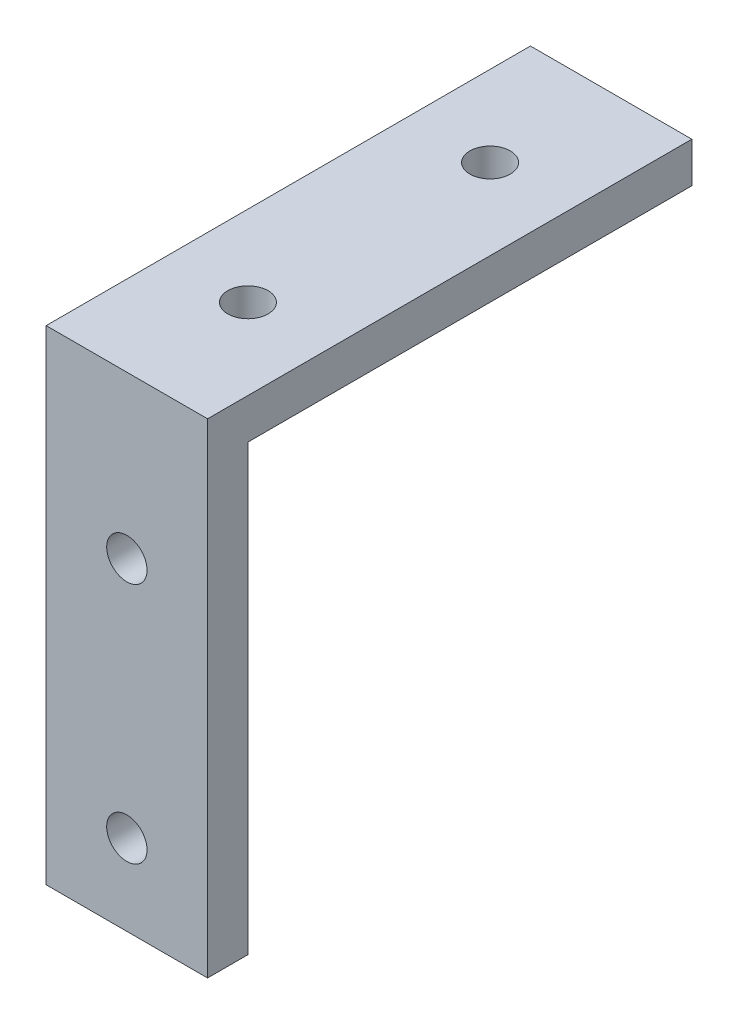
ISO-10303-21;
HEADER;
FILE_DESCRIPTION(('STEP AP214'),'2;1');
FILE_NAME('part.step','',(''),(''),'','','');
FILE_SCHEMA(('AUTOMOTIVE_DESIGN { 1 0 10303 214 1 1 1 1 }'));
ENDSEC;
DATA;
#1=APPLICATION_CONTEXT('core data for automotive mechanical design processes');
#2=APPLICATION_PROTOCOL_DEFINITION('international standard','automotive_design',2000,#1);
#3=PRODUCT_CONTEXT('',#1,'mechanical');
#4=PRODUCT('Part','Part','',(#3));
#5=PRODUCT_RELATED_PRODUCT_CATEGORY('part','',(#4));
#6=PRODUCT_DEFINITION_FORMATION('','',#4);
#7=PRODUCT_DEFINITION_CONTEXT('part definition',#1,'design');
#8=PRODUCT_DEFINITION('design','',#6,#7);
#9=PRODUCT_DEFINITION_SHAPE('','',#8);
#10=(LENGTH_UNIT() NAMED_UNIT(*) SI_UNIT(.MILLI.,.METRE.));
#11=(NAMED_UNIT(*) PLANE_ANGLE_UNIT() SI_UNIT($,.RADIAN.));
#12=(NAMED_UNIT(*) SI_UNIT($,.STERADIAN.) SOLID_ANGLE_UNIT());
#13=UNCERTAINTY_MEASURE_WITH_UNIT(LENGTH_MEASURE(1.E-05),#10,'distance_accuracy_value','');
#14=(GEOMETRIC_REPRESENTATION_CONTEXT(3) GLOBAL_UNCERTAINTY_ASSIGNED_CONTEXT((#13)) GLOBAL_UNIT_ASSIGNED_CONTEXT((#10,
#11,#12)) REPRESENTATION_CONTEXT('',''));
#15=CARTESIAN_POINT('',(0.,0.,0.));
#16=DIRECTION('',(0.,0.,1.));
#17=DIRECTION('',(1.,0.,0.));
#18=AXIS2_PLACEMENT_3D('',#15,#16,#17);
#19=CARTESIAN_POINT('',(12.7,0.,-69.85));
#20=DIRECTION('',(0.,1.,0.));
#21=DIRECTION('',(0.,0.,1.));
#22=AXIS2_PLACEMENT_3D('',#19,#20,#21);
#23=PLANE('',#22);
#24=CARTESIAN_POINT('',(0.,0.,-12.7));
#25=DIRECTION('',(0.,1.,0.));
#26=DIRECTION('',(0.,0.,1.));
#27=AXIS2_PLACEMENT_3D('',#24,#25,#26);
#28=CIRCLE('',#27,3.175);
#29=CARTESIAN_POINT('',(0.,0.,-15.875));
#30=VERTEX_POINT('',#29);
#31=EDGE_CURVE('E162',#30,#30,#28,.T.);
#32=ORIENTED_EDGE('',*,*,#31,.T.);
#33=EDGE_LOOP('',(#32));
#34=FACE_BOUND('',#33,.T.);
#35=CARTESIAN_POINT('',(0.,0.,-50.8));
#36=DIRECTION('',(0.,1.,0.));
#37=DIRECTION('',(0.,0.,1.));
#38=AXIS2_PLACEMENT_3D('',#35,#36,#37);
#39=CIRCLE('',#38,3.175);
#40=CARTESIAN_POINT('',(0.,0.,-53.975));
#41=VERTEX_POINT('',#40);
#42=EDGE_CURVE('E165',#41,#41,#39,.T.);
#43=ORIENTED_EDGE('',*,*,#42,.T.);
#44=EDGE_LOOP('',(#43));
#45=FACE_BOUND('',#44,.T.);
#46=DIRECTION('',(0.,0.,-1.));
#47=VECTOR('',#46,1.);
#48=CARTESIAN_POINT('',(-12.7,0.,-69.85));
#49=LINE('',#48,#47);
#50=CARTESIAN_POINT('',(-12.7,0.,0.));
#51=VERTEX_POINT('',#50);
#52=CARTESIAN_POINT('',(-12.7,0.,-69.85));
#53=VERTEX_POINT('',#52);
#54=EDGE_CURVE('E116',#51,#53,#49,.T.);
#55=ORIENTED_EDGE('',*,*,#54,.T.);
#56=DIRECTION('',(-1.,0.,0.));
#57=VECTOR('',#56,1.);
#58=CARTESIAN_POINT('',(12.7,0.,-69.85));
#59=LINE('',#58,#57);
#60=CARTESIAN_POINT('',(12.7,0.,-69.85));
#61=VERTEX_POINT('',#60);
#62=EDGE_CURVE('E11',#61,#53,#59,.T.);
#63=ORIENTED_EDGE('',*,*,#62,.F.);
#64=DIRECTION('',(0.,0.,-1.));
#65=VECTOR('',#64,1.);
#66=CARTESIAN_POINT('',(12.7,0.,-69.85));
#67=LINE('',#66,#65);
#68=CARTESIAN_POINT('',(12.7,0.,0.));
#69=VERTEX_POINT('',#68);
#70=EDGE_CURVE('E127',#69,#61,#67,.T.);
#71=ORIENTED_EDGE('',*,*,#70,.F.);
#72=DIRECTION('',(-1.,0.,0.));
#73=VECTOR('',#72,1.);
#74=CARTESIAN_POINT('',(12.7,0.,0.));
#75=LINE('',#74,#73);
#76=EDGE_CURVE('E112',#69,#51,#75,.T.);
#77=ORIENTED_EDGE('',*,*,#76,.T.);
#78=EDGE_LOOP('',(#55,#63,#71,#77));
#79=FACE_BOUND('',#78,.T.);
#80=ADVANCED_FACE('F32',(#34,#45,#79),#23,.F.);
#81=CARTESIAN_POINT('',(12.7,6.35000000000001,-69.85));
#82=DIRECTION('',(0.,0.,1.));
#83=DIRECTION('',(1.,0.,0.));
#84=AXIS2_PLACEMENT_3D('',#81,#82,#83);
#85=PLANE('',#84);
#86=DIRECTION('',(0.,1.,0.));
#87=VECTOR('',#86,1.);
#88=CARTESIAN_POINT('',(-12.7,6.35000000000001,-69.85));
#89=LINE('',#88,#87);
#90=CARTESIAN_POINT('',(-12.7,6.35000000000001,-69.85));
#91=VERTEX_POINT('',#90);
#92=EDGE_CURVE('E119',#53,#91,#89,.T.);
#93=ORIENTED_EDGE('',*,*,#92,.T.);
#94=DIRECTION('',(-1.,0.,0.));
#95=VECTOR('',#94,1.);
#96=CARTESIAN_POINT('',(12.7,6.35000000000001,-69.85));
#97=LINE('',#96,#95);
#98=CARTESIAN_POINT('',(12.7,6.35000000000001,-69.85));
#99=VERTEX_POINT('',#98);
#100=EDGE_CURVE('E40',#99,#91,#97,.T.);
#101=ORIENTED_EDGE('',*,*,#100,.F.);
#102=DIRECTION('',(0.,1.,0.));
#103=VECTOR('',#102,1.);
#104=CARTESIAN_POINT('',(12.7,6.35000000000001,-69.85));
#105=LINE('',#104,#103);
#106=EDGE_CURVE('E85',#61,#99,#105,.T.);
#107=ORIENTED_EDGE('',*,*,#106,.F.);
#108=ORIENTED_EDGE('',*,*,#62,.T.);
#109=EDGE_LOOP('',(#93,#101,#107,#108));
#110=FACE_BOUND('',#109,.T.);
#111=ADVANCED_FACE('F154',(#110),#85,.F.);
#112=CARTESIAN_POINT('',(12.7,6.35000000000001,6.34999999999999));
#113=DIRECTION('',(0.,-1.,0.));
#114=DIRECTION('',(0.,0.,-1.));
#115=AXIS2_PLACEMENT_3D('',#112,#113,#114);
#116=PLANE('',#115);
#117=CARTESIAN_POINT('',(0.,6.35000000000001,-12.7));
#118=DIRECTION('',(0.,1.,0.));
#119=DIRECTION('',(0.,0.,1.));
#120=AXIS2_PLACEMENT_3D('',#117,#118,#119);
#121=CIRCLE('',#120,3.175);
#122=CARTESIAN_POINT('',(0.,6.35000000000001,-15.875));
#123=VERTEX_POINT('',#122);
#124=EDGE_CURVE('E167',#123,#123,#121,.T.);
#125=ORIENTED_EDGE('',*,*,#124,.F.);
#126=EDGE_LOOP('',(#125));
#127=FACE_BOUND('',#126,.T.);
#128=CARTESIAN_POINT('',(0.,6.35000000000001,-50.8));
#129=DIRECTION('',(0.,1.,0.));
#130=DIRECTION('',(0.,0.,1.));
#131=AXIS2_PLACEMENT_3D('',#128,#129,#130);
#132=CIRCLE('',#131,3.175);
#133=CARTESIAN_POINT('',(0.,6.35000000000001,-53.975));
#134=VERTEX_POINT('',#133);
#135=EDGE_CURVE('E120',#134,#134,#132,.T.);
#136=ORIENTED_EDGE('',*,*,#135,.F.);
#137=EDGE_LOOP('',(#136));
#138=FACE_BOUND('',#137,.T.);
#139=DIRECTION('',(0.,0.,1.));
#140=VECTOR('',#139,1.);
#141=CARTESIAN_POINT('',(-12.7,6.35000000000001,6.34999999999999));
#142=LINE('',#141,#140);
#143=CARTESIAN_POINT('',(-12.7,6.35000000000001,6.34999999999999));
#144=VERTEX_POINT('',#143);
#145=EDGE_CURVE('E122',#91,#144,#142,.T.);
#146=ORIENTED_EDGE('',*,*,#145,.T.);
#147=DIRECTION('',(-1.,0.,0.));
#148=VECTOR('',#147,1.);
#149=CARTESIAN_POINT('',(12.7,6.35000000000001,6.34999999999999));
#150=LINE('',#149,#148);
#151=CARTESIAN_POINT('',(12.7,6.35000000000001,6.34999999999999));
#152=VERTEX_POINT('',#151);
#153=EDGE_CURVE('E107',#152,#144,#150,.T.);
#154=ORIENTED_EDGE('',*,*,#153,.F.);
#155=DIRECTION('',(0.,0.,1.));
#156=VECTOR('',#155,1.);
#157=CARTESIAN_POINT('',(12.7,6.35000000000001,6.34999999999999));
#158=LINE('',#157,#156);
#159=EDGE_CURVE('E98',#99,#152,#158,.T.);
#160=ORIENTED_EDGE('',*,*,#159,.F.);
#161=ORIENTED_EDGE('',*,*,#100,.T.);
#162=EDGE_LOOP('',(#146,#154,#160,#161));
#163=FACE_BOUND('',#162,.T.);
#164=ADVANCED_FACE('F133',(#127,#138,#163),#116,.F.);
#165=CARTESIAN_POINT('',(12.7,-69.85,6.35));
#166=DIRECTION('',(0.,0.,-1.));
#167=DIRECTION('',(0.,1.,0.));
#168=AXIS2_PLACEMENT_3D('',#165,#166,#167);
#169=PLANE('',#168);
#170=CARTESIAN_POINT('',(0.,-19.05,6.35));
#171=DIRECTION('',(0.,0.,1.));
#172=DIRECTION('',(1.,0.,0.));
#173=AXIS2_PLACEMENT_3D('',#170,#171,#172);
#174=CIRCLE('',#173,3.175);
#175=CARTESIAN_POINT('',(3.175,-19.05,6.35));
#176=VERTEX_POINT('',#175);
#177=EDGE_CURVE('E181',#176,#176,#174,.T.);
#178=ORIENTED_EDGE('',*,*,#177,.F.);
#179=EDGE_LOOP('',(#178));
#180=FACE_BOUND('',#179,.T.);
#181=CARTESIAN_POINT('',(0.,-57.15,6.35));
#182=DIRECTION('',(0.,0.,1.));
#183=DIRECTION('',(1.,0.,0.));
#184=AXIS2_PLACEMENT_3D('',#181,#182,#183);
#185=CIRCLE('',#184,3.175);
#186=CARTESIAN_POINT('',(3.175,-57.15,6.35));
#187=VERTEX_POINT('',#186);
#188=EDGE_CURVE('E176',#187,#187,#185,.T.);
#189=ORIENTED_EDGE('',*,*,#188,.F.);
#190=EDGE_LOOP('',(#189));
#191=FACE_BOUND('',#190,.T.);
#192=DIRECTION('',(0.,-1.,0.));
#193=VECTOR('',#192,1.);
#194=CARTESIAN_POINT('',(-12.7,-69.85,6.35));
#195=LINE('',#194,#193);
#196=CARTESIAN_POINT('',(-12.7,-69.85,6.35));
#197=VERTEX_POINT('',#196);
#198=EDGE_CURVE('E106',#144,#197,#195,.T.);
#199=ORIENTED_EDGE('',*,*,#198,.T.);
#200=DIRECTION('',(-1.,0.,0.));
#201=VECTOR('',#200,1.);
#202=CARTESIAN_POINT('',(12.7,-69.85,6.35));
#203=LINE('',#202,#201);
#204=CARTESIAN_POINT('',(12.7,-69.85,6.35));
#205=VERTEX_POINT('',#204);
#206=EDGE_CURVE('E103',#205,#197,#203,.T.);
#207=ORIENTED_EDGE('',*,*,#206,.F.);
#208=DIRECTION('',(0.,-1.,0.));
#209=VECTOR('',#208,1.);
#210=CARTESIAN_POINT('',(12.7,-69.85,6.35));
#211=LINE('',#210,#209);
#212=EDGE_CURVE('E92',#152,#205,#211,.T.);
#213=ORIENTED_EDGE('',*,*,#212,.F.);
#214=ORIENTED_EDGE('',*,*,#153,.T.);
#215=EDGE_LOOP('',(#199,#207,#213,#214));
#216=FACE_BOUND('',#215,.T.);
#217=ADVANCED_FACE('F104',(#180,#191,#216),#169,.F.);
#218=CARTESIAN_POINT('',(12.7,-69.85,0.));
#219=DIRECTION('',(0.,1.,0.));
#220=DIRECTION('',(0.,0.,1.));
#221=AXIS2_PLACEMENT_3D('',#218,#219,#220);
#222=PLANE('',#221);
#223=DIRECTION('',(0.,0.,-1.));
#224=VECTOR('',#223,1.);
#225=CARTESIAN_POINT('',(-12.7,-69.85,0.));
#226=LINE('',#225,#224);
#227=CARTESIAN_POINT('',(-12.7,-69.85,0.));
#228=VERTEX_POINT('',#227);
#229=EDGE_CURVE('E71',#197,#228,#226,.T.);
#230=ORIENTED_EDGE('',*,*,#229,.T.);
#231=DIRECTION('',(-1.,0.,0.));
#232=VECTOR('',#231,1.);
#233=CARTESIAN_POINT('',(12.7,-69.85,0.));
#234=LINE('',#233,#232);
#235=CARTESIAN_POINT('',(12.7,-69.85,0.));
#236=VERTEX_POINT('',#235);
#237=EDGE_CURVE('E108',#236,#228,#234,.T.);
#238=ORIENTED_EDGE('',*,*,#237,.F.);
#239=DIRECTION('',(0.,0.,-1.));
#240=VECTOR('',#239,1.);
#241=CARTESIAN_POINT('',(12.7,-69.85,0.));
#242=LINE('',#241,#240);
#243=EDGE_CURVE('E96',#205,#236,#242,.T.);
#244=ORIENTED_EDGE('',*,*,#243,.F.);
#245=ORIENTED_EDGE('',*,*,#206,.T.);
#246=EDGE_LOOP('',(#230,#238,#244,#245));
#247=FACE_BOUND('',#246,.T.);
#248=ADVANCED_FACE('F110',(#247),#222,.F.);
#249=CARTESIAN_POINT('',(12.7,0.,0.));
#250=DIRECTION('',(0.,0.,1.));
#251=DIRECTION('',(0.,-1.,0.));
#252=AXIS2_PLACEMENT_3D('',#249,#250,#251);
#253=PLANE('',#252);
#254=CARTESIAN_POINT('',(0.,-19.05,0.));
#255=DIRECTION('',(0.,0.,1.));
#256=DIRECTION('',(1.,0.,0.));
#257=AXIS2_PLACEMENT_3D('',#254,#255,#256);
#258=CIRCLE('',#257,3.175);
#259=CARTESIAN_POINT('',(3.175,-19.05,0.));
#260=VERTEX_POINT('',#259);
#261=EDGE_CURVE('E184',#260,#260,#258,.T.);
#262=ORIENTED_EDGE('',*,*,#261,.T.);
#263=EDGE_LOOP('',(#262));
#264=FACE_BOUND('',#263,.T.);
#265=CARTESIAN_POINT('',(0.,-57.15,0.));
#266=DIRECTION('',(0.,0.,1.));
#267=DIRECTION('',(1.,0.,0.));
#268=AXIS2_PLACEMENT_3D('',#265,#266,#267);
#269=CIRCLE('',#268,3.175);
#270=CARTESIAN_POINT('',(3.175,-57.15,0.));
#271=VERTEX_POINT('',#270);
#272=EDGE_CURVE('E178',#271,#271,#269,.T.);
#273=ORIENTED_EDGE('',*,*,#272,.T.);
#274=EDGE_LOOP('',(#273));
#275=FACE_BOUND('',#274,.T.);
#276=DIRECTION('',(0.,1.,0.));
#277=VECTOR('',#276,1.);
#278=CARTESIAN_POINT('',(-12.7,0.,0.));
#279=LINE('',#278,#277);
#280=EDGE_CURVE('E77',#228,#51,#279,.T.);
#281=ORIENTED_EDGE('',*,*,#280,.T.);
#282=ORIENTED_EDGE('',*,*,#76,.F.);
#283=DIRECTION('',(0.,1.,0.));
#284=VECTOR('',#283,1.);
#285=CARTESIAN_POINT('',(12.7,0.,0.));
#286=LINE('',#285,#284);
#287=EDGE_CURVE('E48',#236,#69,#286,.T.);
#288=ORIENTED_EDGE('',*,*,#287,.F.);
#289=ORIENTED_EDGE('',*,*,#237,.T.);
#290=EDGE_LOOP('',(#281,#282,#288,#289));
#291=FACE_BOUND('',#290,.T.);
#292=ADVANCED_FACE('F140',(#264,#275,#291),#253,.F.);
#293=CARTESIAN_POINT('',(12.7,0.,0.));
#294=DIRECTION('',(1.,0.,0.));
#295=DIRECTION('',(0.,0.,-1.));
#296=AXIS2_PLACEMENT_3D('',#293,#294,#295);
#297=PLANE('',#296);
#298=ORIENTED_EDGE('',*,*,#70,.T.);
#299=ORIENTED_EDGE('',*,*,#106,.T.);
#300=ORIENTED_EDGE('',*,*,#159,.T.);
#301=ORIENTED_EDGE('',*,*,#212,.T.);
#302=ORIENTED_EDGE('',*,*,#243,.T.);
#303=ORIENTED_EDGE('',*,*,#287,.T.);
#304=EDGE_LOOP('',(#298,#299,#300,#301,#302,#303));
#305=FACE_BOUND('',#304,.T.);
#306=ADVANCED_FACE('F94',(#305),#297,.T.);
#307=CARTESIAN_POINT('',(-12.7,0.,0.));
#308=DIRECTION('',(1.,0.,0.));
#309=DIRECTION('',(0.,0.,-1.));
#310=AXIS2_PLACEMENT_3D('',#307,#308,#309);
#311=PLANE('',#310);
#312=ORIENTED_EDGE('',*,*,#54,.F.);
#313=ORIENTED_EDGE('',*,*,#280,.F.);
#314=ORIENTED_EDGE('',*,*,#229,.F.);
#315=ORIENTED_EDGE('',*,*,#198,.F.);
#316=ORIENTED_EDGE('',*,*,#145,.F.);
#317=ORIENTED_EDGE('',*,*,#92,.F.);
#318=EDGE_LOOP('',(#312,#313,#314,#315,#316,#317));
#319=FACE_BOUND('',#318,.T.);
#320=ADVANCED_FACE('F136',(#319),#311,.F.);
#321=CARTESIAN_POINT('',(0.,6.35000000000001,-50.8));
#322=DIRECTION('',(0.,-1.,0.));
#323=DIRECTION('',(0.,0.,-1.));
#324=AXIS2_PLACEMENT_3D('',#321,#322,#323);
#325=CYLINDRICAL_SURFACE('',#324,3.175);
#326=CARTESIAN_POINT('',(0.,6.35000000000001,-53.975));
#327=CARTESIAN_POINT('',(0.,6.28385416666667,-53.975));
#328=CARTESIAN_POINT('',(0.,6.21770833333334,-53.975));
#329=CARTESIAN_POINT('',(0.,6.08541666666667,-53.975));
#330=CARTESIAN_POINT('',(0.,6.01927083333334,-53.975));
#331=CARTESIAN_POINT('',(0.,5.88697916666667,-53.975));
#332=CARTESIAN_POINT('',(0.,5.82083333333334,-53.975));
#333=CARTESIAN_POINT('',(0.,5.68854166666667,-53.975));
#334=CARTESIAN_POINT('',(0.,5.62239583333334,-53.975));
#335=CARTESIAN_POINT('',(0.,5.49010416666667,-53.975));
#336=CARTESIAN_POINT('',(0.,5.42395833333334,-53.975));
#337=CARTESIAN_POINT('',(0.,5.29166666666667,-53.975));
#338=CARTESIAN_POINT('',(0.,5.22552083333334,-53.975));
#339=CARTESIAN_POINT('',(0.,5.09322916666667,-53.975));
#340=CARTESIAN_POINT('',(0.,5.02708333333334,-53.975));
#341=CARTESIAN_POINT('',(0.,4.89479166666667,-53.975));
#342=CARTESIAN_POINT('',(0.,4.82864583333334,-53.975));
#343=CARTESIAN_POINT('',(0.,4.69635416666667,-53.975));
#344=CARTESIAN_POINT('',(0.,4.63020833333334,-53.975));
#345=CARTESIAN_POINT('',(0.,4.49791666666667,-53.975));
#346=CARTESIAN_POINT('',(0.,4.43177083333334,-53.975));
#347=CARTESIAN_POINT('',(0.,4.29947916666667,-53.975));
#348=CARTESIAN_POINT('',(0.,4.23333333333334,-53.975));
#349=CARTESIAN_POINT('',(0.,4.10104166666667,-53.975));
#350=CARTESIAN_POINT('',(0.,4.03489583333334,-53.975));
#351=CARTESIAN_POINT('',(0.,3.90260416666667,-53.975));
#352=CARTESIAN_POINT('',(0.,3.83645833333334,-53.975));
#353=CARTESIAN_POINT('',(0.,3.70416666666667,-53.975));
#354=CARTESIAN_POINT('',(0.,3.63802083333334,-53.975));
#355=CARTESIAN_POINT('',(0.,3.50572916666667,-53.975));
#356=CARTESIAN_POINT('',(0.,3.43958333333334,-53.975));
#357=CARTESIAN_POINT('',(0.,3.30729166666667,-53.975));
#358=CARTESIAN_POINT('',(0.,3.24114583333334,-53.975));
#359=CARTESIAN_POINT('',(0.,3.10885416666667,-53.975));
#360=CARTESIAN_POINT('',(0.,3.04270833333334,-53.975));
#361=CARTESIAN_POINT('',(0.,2.91041666666667,-53.975));
#362=CARTESIAN_POINT('',(0.,2.84427083333334,-53.975));
#363=CARTESIAN_POINT('',(0.,2.71197916666667,-53.975));
#364=CARTESIAN_POINT('',(0.,2.64583333333334,-53.975));
#365=CARTESIAN_POINT('',(0.,2.51354166666667,-53.975));
#366=CARTESIAN_POINT('',(0.,2.44739583333334,-53.975));
#367=CARTESIAN_POINT('',(0.,2.31510416666667,-53.975));
#368=CARTESIAN_POINT('',(0.,2.24895833333334,-53.975));
#369=CARTESIAN_POINT('',(0.,2.11666666666667,-53.975));
#370=CARTESIAN_POINT('',(0.,2.05052083333334,-53.975));
#371=CARTESIAN_POINT('',(0.,1.91822916666667,-53.975));
#372=CARTESIAN_POINT('',(0.,1.85208333333334,-53.975));
#373=CARTESIAN_POINT('',(0.,1.71979166666667,-53.975));
#374=CARTESIAN_POINT('',(0.,1.65364583333333,-53.975));
#375=CARTESIAN_POINT('',(0.,1.52135416666667,-53.975));
#376=CARTESIAN_POINT('',(0.,1.45520833333333,-53.975));
#377=CARTESIAN_POINT('',(0.,1.32291666666667,-53.975));
#378=CARTESIAN_POINT('',(0.,1.25677083333333,-53.975));
#379=CARTESIAN_POINT('',(0.,1.12447916666667,-53.975));
#380=CARTESIAN_POINT('',(0.,1.05833333333333,-53.975));
#381=CARTESIAN_POINT('',(0.,0.926041666666667,-53.975));
#382=CARTESIAN_POINT('',(0.,0.859895833333334,-53.975));
#383=CARTESIAN_POINT('',(0.,0.727604166666667,-53.975));
#384=CARTESIAN_POINT('',(0.,0.661458333333334,-53.975));
#385=CARTESIAN_POINT('',(0.,0.529166666666667,-53.975));
#386=CARTESIAN_POINT('',(0.,0.463020833333333,-53.975));
#387=CARTESIAN_POINT('',(0.,0.330729166666666,-53.975));
#388=CARTESIAN_POINT('',(0.,0.264583333333333,-53.975));
#389=CARTESIAN_POINT('',(0.,0.132291666666666,-53.975));
#390=CARTESIAN_POINT('',(0.,0.0661458333333326,-53.975));
#391=CARTESIAN_POINT('',(0.,0.,-53.975));
#392=B_SPLINE_CURVE_WITH_KNOTS('',3,(#326,#327,#328,#329,#330,#331,#332,#333,#334,#335,#336,
#337,#338,#339,#340,#341,#342,#343,#344,#345,#346,#347,#348,#349,#350,#351,#352,#353,#354,#355,
#356,#357,#358,#359,#360,#361,#362,#363,#364,#365,#366,#367,#368,#369,#370,#371,#372,#373,#374,
#375,#376,#377,#378,#379,#380,#381,#382,#383,#384,#385,#386,#387,#388,#389,#390,#391),
.UNSPECIFIED.,.F.,.F.,(4,2,2,2,2,2,2,2,2,2,2,2,2,2,2,2,2,2,2,2,2,2,2,2,2,2,2,2,2,2,2,2,4),(0.,
0.198437500000001,0.396875000000001,0.595312500000001,0.793750000000002,0.992187500000002,
1.190625,1.3890625,1.5875,1.7859375,1.984375,2.1828125,2.38125,2.5796875,2.778125,2.9765625,
3.17500000000001,3.37343750000001,3.57187500000001,3.77031250000001,3.96875000000001,
4.16718750000001,4.36562500000001,4.56406250000001,4.76250000000001,4.96093750000001,
5.15937500000001,5.35781250000001,5.55625000000001,5.75468750000001,5.95312500000001,
6.15156250000001,6.35000000000001),.UNSPECIFIED.);
#393=EDGE_CURVE('BSEAM208',#134,#41,#392,.T.);
#394=ORIENTED_EDGE('',*,*,#135,.T.);
#395=ORIENTED_EDGE('',*,*,#42,.F.);
#396=ORIENTED_EDGE('',*,*,#393,.T.);
#397=ORIENTED_EDGE('',*,*,#393,.F.);
#398=EDGE_LOOP('',(#394,#396,#395,#397));
#399=FACE_BOUND('',#398,.T.);
#400=ADVANCED_FACE('F208',(#399),#325,.F.);
#401=CARTESIAN_POINT('',(0.,6.35000000000001,-12.7));
#402=DIRECTION('',(0.,-1.,0.));
#403=DIRECTION('',(0.,0.,-1.));
#404=AXIS2_PLACEMENT_3D('',#401,#402,#403);
#405=CYLINDRICAL_SURFACE('',#404,3.175);
#406=CARTESIAN_POINT('',(0.,6.35000000000001,-15.875));
#407=CARTESIAN_POINT('',(0.,6.28385416666667,-15.875));
#408=CARTESIAN_POINT('',(0.,6.21770833333334,-15.875));
#409=CARTESIAN_POINT('',(0.,6.08541666666667,-15.875));
#410=CARTESIAN_POINT('',(0.,6.01927083333334,-15.875));
#411=CARTESIAN_POINT('',(0.,5.88697916666667,-15.875));
#412=CARTESIAN_POINT('',(0.,5.82083333333334,-15.875));
#413=CARTESIAN_POINT('',(0.,5.68854166666667,-15.875));
#414=CARTESIAN_POINT('',(0.,5.62239583333334,-15.875));
#415=CARTESIAN_POINT('',(0.,5.49010416666667,-15.875));
#416=CARTESIAN_POINT('',(0.,5.42395833333334,-15.875));
#417=CARTESIAN_POINT('',(0.,5.29166666666667,-15.875));
#418=CARTESIAN_POINT('',(0.,5.22552083333334,-15.875));
#419=CARTESIAN_POINT('',(0.,5.09322916666667,-15.875));
#420=CARTESIAN_POINT('',(0.,5.02708333333334,-15.875));
#421=CARTESIAN_POINT('',(0.,4.89479166666667,-15.875));
#422=CARTESIAN_POINT('',(0.,4.82864583333334,-15.875));
#423=CARTESIAN_POINT('',(0.,4.69635416666667,-15.875));
#424=CARTESIAN_POINT('',(0.,4.63020833333334,-15.875));
#425=CARTESIAN_POINT('',(0.,4.49791666666667,-15.875));
#426=CARTESIAN_POINT('',(0.,4.43177083333334,-15.875));
#427=CARTESIAN_POINT('',(0.,4.29947916666667,-15.875));
#428=CARTESIAN_POINT('',(0.,4.23333333333334,-15.875));
#429=CARTESIAN_POINT('',(0.,4.10104166666667,-15.875));
#430=CARTESIAN_POINT('',(0.,4.03489583333334,-15.875));
#431=CARTESIAN_POINT('',(0.,3.90260416666667,-15.875));
#432=CARTESIAN_POINT('',(0.,3.83645833333334,-15.875));
#433=CARTESIAN_POINT('',(0.,3.70416666666667,-15.875));
#434=CARTESIAN_POINT('',(0.,3.63802083333334,-15.875));
#435=CARTESIAN_POINT('',(0.,3.50572916666667,-15.875));
#436=CARTESIAN_POINT('',(0.,3.43958333333334,-15.875));
#437=CARTESIAN_POINT('',(0.,3.30729166666667,-15.875));
#438=CARTESIAN_POINT('',(0.,3.24114583333334,-15.875));
#439=CARTESIAN_POINT('',(0.,3.10885416666667,-15.875));
#440=CARTESIAN_POINT('',(0.,3.04270833333334,-15.875));
#441=CARTESIAN_POINT('',(0.,2.91041666666667,-15.875));
#442=CARTESIAN_POINT('',(0.,2.84427083333334,-15.875));
#443=CARTESIAN_POINT('',(0.,2.71197916666667,-15.875));
#444=CARTESIAN_POINT('',(0.,2.64583333333334,-15.875));
#445=CARTESIAN_POINT('',(0.,2.51354166666667,-15.875));
#446=CARTESIAN_POINT('',(0.,2.44739583333334,-15.875));
#447=CARTESIAN_POINT('',(0.,2.31510416666667,-15.875));
#448=CARTESIAN_POINT('',(0.,2.24895833333334,-15.875));
#449=CARTESIAN_POINT('',(0.,2.11666666666667,-15.875));
#450=CARTESIAN_POINT('',(0.,2.05052083333334,-15.875));
#451=CARTESIAN_POINT('',(0.,1.91822916666667,-15.875));
#452=CARTESIAN_POINT('',(0.,1.85208333333334,-15.875));
#453=CARTESIAN_POINT('',(0.,1.71979166666667,-15.875));
#454=CARTESIAN_POINT('',(0.,1.65364583333333,-15.875));
#455=CARTESIAN_POINT('',(0.,1.52135416666667,-15.875));
#456=CARTESIAN_POINT('',(0.,1.45520833333333,-15.875));
#457=CARTESIAN_POINT('',(0.,1.32291666666667,-15.875));
#458=CARTESIAN_POINT('',(0.,1.25677083333333,-15.875));
#459=CARTESIAN_POINT('',(0.,1.12447916666667,-15.875));
#460=CARTESIAN_POINT('',(0.,1.05833333333333,-15.875));
#461=CARTESIAN_POINT('',(0.,0.926041666666667,-15.875));
#462=CARTESIAN_POINT('',(0.,0.859895833333334,-15.875));
#463=CARTESIAN_POINT('',(0.,0.727604166666667,-15.875));
#464=CARTESIAN_POINT('',(0.,0.661458333333334,-15.875));
#465=CARTESIAN_POINT('',(0.,0.529166666666667,-15.875));
#466=CARTESIAN_POINT('',(0.,0.463020833333333,-15.875));
#467=CARTESIAN_POINT('',(0.,0.330729166666666,-15.875));
#468=CARTESIAN_POINT('',(0.,0.264583333333333,-15.875));
#469=CARTESIAN_POINT('',(0.,0.132291666666666,-15.875));
#470=CARTESIAN_POINT('',(0.,0.0661458333333326,-15.875));
#471=CARTESIAN_POINT('',(0.,0.,-15.875));
#472=B_SPLINE_CURVE_WITH_KNOTS('',3,(#406,#407,#408,#409,#410,#411,#412,#413,#414,#415,#416,
#417,#418,#419,#420,#421,#422,#423,#424,#425,#426,#427,#428,#429,#430,#431,#432,#433,#434,#435,
#436,#437,#438,#439,#440,#441,#442,#443,#444,#445,#446,#447,#448,#449,#450,#451,#452,#453,#454,
#455,#456,#457,#458,#459,#460,#461,#462,#463,#464,#465,#466,#467,#468,#469,#470,#471),
.UNSPECIFIED.,.F.,.F.,(4,2,2,2,2,2,2,2,2,2,2,2,2,2,2,2,2,2,2,2,2,2,2,2,2,2,2,2,2,2,2,2,4),(0.,
0.198437500000001,0.396875000000001,0.595312500000001,0.793750000000002,0.992187500000002,
1.190625,1.3890625,1.5875,1.7859375,1.984375,2.1828125,2.38125,2.5796875,2.778125,2.9765625,
3.17500000000001,3.37343750000001,3.57187500000001,3.77031250000001,3.96875000000001,
4.16718750000001,4.36562500000001,4.56406250000001,4.76250000000001,4.96093750000001,
5.15937500000001,5.35781250000001,5.55625000000001,5.75468750000001,5.95312500000001,
6.15156250000001,6.35000000000001),.UNSPECIFIED.);
#473=EDGE_CURVE('BSEAM200',#123,#30,#472,.T.);
#474=ORIENTED_EDGE('',*,*,#124,.T.);
#475=ORIENTED_EDGE('',*,*,#31,.F.);
#476=ORIENTED_EDGE('',*,*,#473,.T.);
#477=ORIENTED_EDGE('',*,*,#473,.F.);
#478=EDGE_LOOP('',(#474,#476,#475,#477));
#479=FACE_BOUND('',#478,.T.);
#480=ADVANCED_FACE('F200',(#479),#405,.F.);
#481=CARTESIAN_POINT('',(0.,-57.15,6.35));
#482=DIRECTION('',(0.,0.,-1.));
#483=DIRECTION('',(-1.,0.,0.));
#484=AXIS2_PLACEMENT_3D('',#481,#482,#483);
#485=CYLINDRICAL_SURFACE('',#484,3.175);
#486=ORIENTED_EDGE('',*,*,#188,.T.);
#487=EDGE_LOOP('',(#486));
#488=FACE_BOUND('',#487,.T.);
#489=ORIENTED_EDGE('',*,*,#272,.F.);
#490=EDGE_LOOP('',(#489));
#491=FACE_BOUND('',#490,.T.);
#492=ADVANCED_FACE('F197',(#488,#491),#485,.F.);
#493=CARTESIAN_POINT('',(0.,-19.05,6.35));
#494=DIRECTION('',(0.,0.,-1.));
#495=DIRECTION('',(-1.,0.,0.));
#496=AXIS2_PLACEMENT_3D('',#493,#494,#495);
#497=CYLINDRICAL_SURFACE('',#496,3.175);
#498=ORIENTED_EDGE('',*,*,#177,.T.);
#499=EDGE_LOOP('',(#498));
#500=FACE_BOUND('',#499,.T.);
#501=ORIENTED_EDGE('',*,*,#261,.F.);
#502=EDGE_LOOP('',(#501));
#503=FACE_BOUND('',#502,.T.);
#504=ADVANCED_FACE('F189',(#500,#503),#497,.F.);
#505=CLOSED_SHELL('',(#80,#111,#164,#217,#248,#292,#306,#320,#400,#480,#492,#504));
#506=MANIFOLD_SOLID_BREP('B2',#505);
#507=ADVANCED_BREP_SHAPE_REPRESENTATION('',(#18,#506),#14);
#508=SHAPE_DEFINITION_REPRESENTATION(#9,#507);
ENDSEC;
END-ISO-10303-21;
